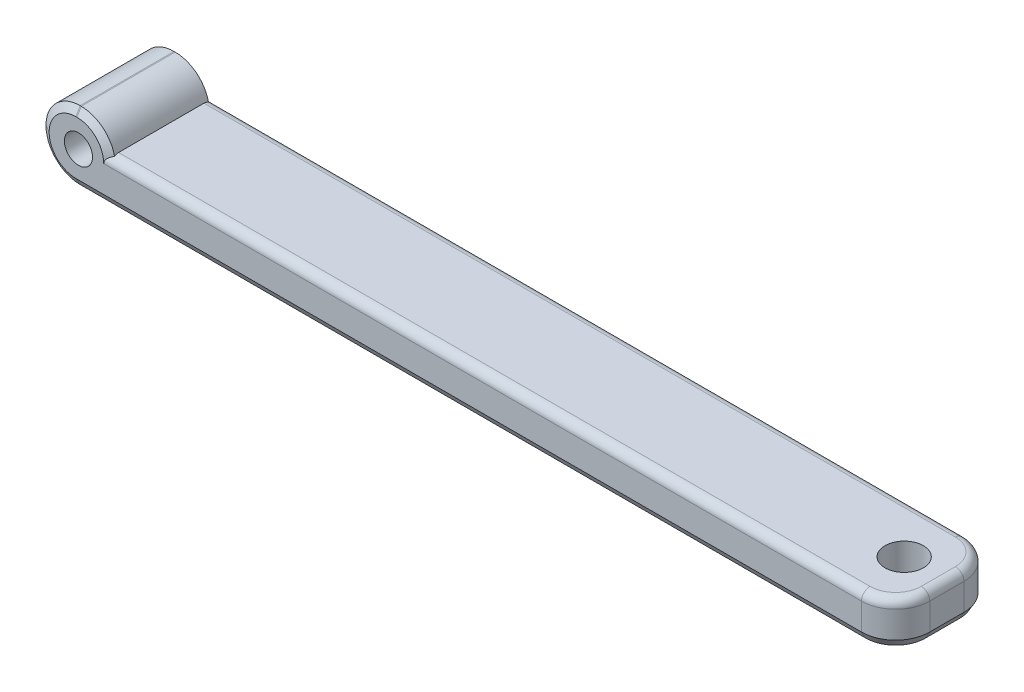
ISO-10303-21;
HEADER;
FILE_DESCRIPTION(('STEP AP214'),'2;1');
FILE_NAME('part.step','',(''),(''),'','','');
FILE_SCHEMA(('AUTOMOTIVE_DESIGN { 1 0 10303 214 1 1 1 1 }'));
ENDSEC;
DATA;
#1=APPLICATION_CONTEXT('core data for automotive mechanical design processes');
#2=APPLICATION_PROTOCOL_DEFINITION('international standard','automotive_design',2000,#1);
#3=PRODUCT_CONTEXT('',#1,'mechanical');
#4=PRODUCT('Part','Part','',(#3));
#5=PRODUCT_RELATED_PRODUCT_CATEGORY('part','',(#4));
#6=PRODUCT_DEFINITION_FORMATION('','',#4);
#7=PRODUCT_DEFINITION_CONTEXT('part definition',#1,'design');
#8=PRODUCT_DEFINITION('design','',#6,#7);
#9=PRODUCT_DEFINITION_SHAPE('','',#8);
#10=(LENGTH_UNIT() NAMED_UNIT(*) SI_UNIT(.MILLI.,.METRE.));
#11=(NAMED_UNIT(*) PLANE_ANGLE_UNIT() SI_UNIT($,.RADIAN.));
#12=(NAMED_UNIT(*) SI_UNIT($,.STERADIAN.) SOLID_ANGLE_UNIT());
#13=UNCERTAINTY_MEASURE_WITH_UNIT(LENGTH_MEASURE(1.E-05),#10,'distance_accuracy_value','');
#14=(GEOMETRIC_REPRESENTATION_CONTEXT(3) GLOBAL_UNCERTAINTY_ASSIGNED_CONTEXT((#13)) GLOBAL_UNIT_ASSIGNED_CONTEXT((#10,
#11,#12)) REPRESENTATION_CONTEXT('',''));
#15=CARTESIAN_POINT('',(0.,0.,0.));
#16=DIRECTION('',(0.,0.,1.));
#17=DIRECTION('',(1.,0.,0.));
#18=AXIS2_PLACEMENT_3D('',#15,#16,#17);
#19=CARTESIAN_POINT('',(0.,5.,0.));
#20=DIRECTION('',(0.,-1.,0.));
#21=DIRECTION('',(0.,0.,-1.));
#22=AXIS2_PLACEMENT_3D('',#19,#20,#21);
#23=PLANE('',#22);
#24=CARTESIAN_POINT('',(45.,5.,0.));
#25=DIRECTION('',(0.,1.,0.));
#26=DIRECTION('',(0.,0.,1.));
#27=AXIS2_PLACEMENT_3D('',#24,#25,#26);
#28=CIRCLE('',#27,2.25);
#29=CARTESIAN_POINT('',(45.,5.,2.25));
#30=VERTEX_POINT('',#29);
#31=EDGE_CURVE('E334',#30,#30,#28,.T.);
#32=ORIENTED_EDGE('',*,*,#31,.F.);
#33=EDGE_LOOP('',(#32));
#34=FACE_BOUND('',#33,.T.);
#35=CARTESIAN_POINT('',(46.,5.,-2.));
#36=DIRECTION('',(0.,-1.,0.));
#37=DIRECTION('',(0.,0.,-1.));
#38=AXIS2_PLACEMENT_3D('',#35,#36,#37);
#39=CIRCLE('',#38,3.);
#40=CARTESIAN_POINT('',(49.,5.,-2.));
#41=VERTEX_POINT('',#40);
#42=CARTESIAN_POINT('',(46.,5.,-5.));
#43=VERTEX_POINT('',#42);
#44=EDGE_CURVE('E343',#41,#43,#39,.F.);
#45=ORIENTED_EDGE('',*,*,#44,.T.);
#46=DIRECTION('',(-1.,0.,0.));
#47=VECTOR('',#46,1.);
#48=CARTESIAN_POINT('',(0.,5.,-5.));
#49=LINE('',#48,#47);
#50=CARTESIAN_POINT('',(-42.,5.,-5.));
#51=VERTEX_POINT('',#50);
#52=EDGE_CURVE('E346',#43,#51,#49,.T.);
#53=ORIENTED_EDGE('',*,*,#52,.T.);
#54=DIRECTION('',(0.,0.,-1.));
#55=VECTOR('',#54,1.);
#56=CARTESIAN_POINT('',(-42.,5.,-6.));
#57=LINE('',#56,#55);
#58=CARTESIAN_POINT('',(-42.,5.,5.));
#59=VERTEX_POINT('',#58);
#60=EDGE_CURVE('E475',#59,#51,#57,.T.);
#61=ORIENTED_EDGE('',*,*,#60,.F.);
#62=DIRECTION('',(1.,0.,0.));
#63=VECTOR('',#62,1.);
#64=CARTESIAN_POINT('',(0.,5.,5.));
#65=LINE('',#64,#63);
#66=CARTESIAN_POINT('',(46.,5.,5.));
#67=VERTEX_POINT('',#66);
#68=EDGE_CURVE('E294',#59,#67,#65,.T.);
#69=ORIENTED_EDGE('',*,*,#68,.T.);
#70=CARTESIAN_POINT('',(46.,5.,2.));
#71=DIRECTION('',(0.,-1.,0.));
#72=DIRECTION('',(0.,0.,-1.));
#73=AXIS2_PLACEMENT_3D('',#70,#71,#72);
#74=CIRCLE('',#73,3.);
#75=CARTESIAN_POINT('',(49.,5.,2.));
#76=VERTEX_POINT('',#75);
#77=EDGE_CURVE('E337',#67,#76,#74,.F.);
#78=ORIENTED_EDGE('',*,*,#77,.T.);
#79=DIRECTION('',(0.,0.,-1.));
#80=VECTOR('',#79,1.);
#81=CARTESIAN_POINT('',(49.,5.,0.));
#82=LINE('',#81,#80);
#83=EDGE_CURVE('E340',#76,#41,#82,.T.);
#84=ORIENTED_EDGE('',*,*,#83,.T.);
#85=EDGE_LOOP('',(#45,#53,#61,#69,#78,#84));
#86=FACE_BOUND('',#85,.T.);
#87=ADVANCED_FACE('F41',(#34,#86),#23,.F.);
#88=CARTESIAN_POINT('',(50.,5.,6.));
#89=DIRECTION('',(-1.,0.,0.));
#90=DIRECTION('',(0.,0.,1.));
#91=AXIS2_PLACEMENT_3D('',#88,#89,#90);
#92=PLANE('',#91);
#93=DIRECTION('',(0.,-1.,0.));
#94=VECTOR('',#93,1.);
#95=CARTESIAN_POINT('',(50.,5.,-2.));
#96=LINE('',#95,#94);
#97=CARTESIAN_POINT('',(50.,0.866025403784468,-2.));
#98=VERTEX_POINT('',#97);
#99=CARTESIAN_POINT('',(50.,4.,-2.));
#100=VERTEX_POINT('',#99);
#101=EDGE_CURVE('E196',#98,#100,#96,.F.);
#102=ORIENTED_EDGE('',*,*,#101,.T.);
#103=DIRECTION('',(0.,0.,-1.));
#104=VECTOR('',#103,1.);
#105=CARTESIAN_POINT('',(50.,4.,6.));
#106=LINE('',#105,#104);
#107=CARTESIAN_POINT('',(50.,4.,2.));
#108=VERTEX_POINT('',#107);
#109=EDGE_CURVE('E355',#100,#108,#106,.F.);
#110=ORIENTED_EDGE('',*,*,#109,.T.);
#111=DIRECTION('',(0.,-1.,0.));
#112=VECTOR('',#111,1.);
#113=CARTESIAN_POINT('',(50.,5.,2.));
#114=LINE('',#113,#112);
#115=CARTESIAN_POINT('',(50.,0.866025403784468,2.));
#116=VERTEX_POINT('',#115);
#117=EDGE_CURVE('E187',#108,#116,#114,.T.);
#118=ORIENTED_EDGE('',*,*,#117,.T.);
#119=DIRECTION('',(0.,0.,-1.));
#120=VECTOR('',#119,1.);
#121=CARTESIAN_POINT('',(50.,0.866025403784468,-2.));
#122=LINE('',#121,#120);
#123=EDGE_CURVE('E201',#116,#98,#122,.T.);
#124=ORIENTED_EDGE('',*,*,#123,.T.);
#125=EDGE_LOOP('',(#102,#110,#118,#124));
#126=FACE_BOUND('',#125,.T.);
#127=ADVANCED_FACE('F392',(#126),#92,.F.);
#128=CARTESIAN_POINT('',(-50.,5.,-6.));
#129=DIRECTION('',(0.,0.,1.));
#130=DIRECTION('',(1.,0.,0.));
#131=AXIS2_PLACEMENT_3D('',#128,#129,#130);
#132=PLANE('',#131);
#133=CARTESIAN_POINT('',(-45.7,4.,-6.));
#134=DIRECTION('',(0.,0.,1.));
#135=DIRECTION('',(1.,0.,0.));
#136=AXIS2_PLACEMENT_3D('',#133,#134,#135);
#137=CIRCLE('',#136,1.65);
#138=CARTESIAN_POINT('',(-44.05,4.,-6.));
#139=VERTEX_POINT('',#138);
#140=EDGE_CURVE('E479',#139,#139,#137,.T.);
#141=ORIENTED_EDGE('',*,*,#140,.T.);
#142=EDGE_LOOP('',(#141));
#143=FACE_BOUND('',#142,.T.);
#144=CARTESIAN_POINT('',(-45.8729833462074,4.,-6.));
#145=DIRECTION('',(0.,0.,1.));
#146=DIRECTION('',(1.,0.,0.));
#147=AXIS2_PLACEMENT_3D('',#144,#145,#146);
#148=CIRCLE('',#147,3.13397459621553);
#149=CARTESIAN_POINT('',(-45.8729833462074,7.13397459621553,-6.));
#150=VERTEX_POINT('',#149);
#151=CARTESIAN_POINT('',(-42.7390087499919,4.,-6.));
#152=VERTEX_POINT('',#151);
#153=EDGE_CURVE('E235',#150,#152,#148,.F.);
#154=ORIENTED_EDGE('',*,*,#153,.T.);
#155=DIRECTION('',(-1.,0.,0.));
#156=VECTOR('',#155,1.);
#157=CARTESIAN_POINT('',(-50.,4.,-6.));
#158=LINE('',#157,#156);
#159=CARTESIAN_POINT('',(46.,4.,-6.));
#160=VERTEX_POINT('',#159);
#161=EDGE_CURVE('E183',#152,#160,#158,.F.);
#162=ORIENTED_EDGE('',*,*,#161,.T.);
#163=DIRECTION('',(0.,-1.,0.));
#164=VECTOR('',#163,1.);
#165=CARTESIAN_POINT('',(46.,5.,-6.));
#166=LINE('',#165,#164);
#167=CARTESIAN_POINT('',(46.,0.866025403784468,-6.));
#168=VERTEX_POINT('',#167);
#169=EDGE_CURVE('E176',#160,#168,#166,.T.);
#170=ORIENTED_EDGE('',*,*,#169,.T.);
#171=DIRECTION('',(-1.,0.,0.));
#172=VECTOR('',#171,1.);
#173=CARTESIAN_POINT('',(-46.,0.866025403784468,-6.));
#174=LINE('',#173,#172);
#175=CARTESIAN_POINT('',(-46.,0.866025403784468,-6.));
#176=VERTEX_POINT('',#175);
#177=EDGE_CURVE('E180',#168,#176,#174,.T.);
#178=ORIENTED_EDGE('',*,*,#177,.T.);
#179=CARTESIAN_POINT('',(-46.,4.,-6.));
#180=DIRECTION('',(0.,0.,1.));
#181=DIRECTION('',(1.,0.,0.));
#182=AXIS2_PLACEMENT_3D('',#179,#180,#181);
#183=CIRCLE('',#182,3.13397459621553);
#184=CARTESIAN_POINT('',(-49.1339745962155,4.,-6.));
#185=VERTEX_POINT('',#184);
#186=EDGE_CURVE('E219',#176,#185,#183,.F.);
#187=ORIENTED_EDGE('',*,*,#186,.T.);
#188=CARTESIAN_POINT('',(-46.,4.,-6.));
#189=DIRECTION('',(0.,0.,1.));
#190=DIRECTION('',(1.,0.,0.));
#191=AXIS2_PLACEMENT_3D('',#188,#189,#190);
#192=CIRCLE('',#191,3.13397459621553);
#193=CARTESIAN_POINT('',(-46.,7.13397459621553,-6.));
#194=VERTEX_POINT('',#193);
#195=EDGE_CURVE('E224',#185,#194,#192,.F.);
#196=ORIENTED_EDGE('',*,*,#195,.T.);
#197=DIRECTION('',(1.,0.,0.));
#198=VECTOR('',#197,1.);
#199=CARTESIAN_POINT('',(-45.8729833462074,7.13397459621553,-6.));
#200=LINE('',#199,#198);
#201=EDGE_CURVE('E232',#194,#150,#200,.T.);
#202=ORIENTED_EDGE('',*,*,#201,.T.);
#203=EDGE_LOOP('',(#154,#162,#170,#178,#187,#196,#202));
#204=FACE_BOUND('',#203,.T.);
#205=ADVANCED_FACE('F178',(#143,#204),#132,.F.);
#206=CARTESIAN_POINT('',(-50.,5.,6.));
#207=DIRECTION('',(0.,0.,-1.));
#208=DIRECTION('',(-1.,0.,0.));
#209=AXIS2_PLACEMENT_3D('',#206,#207,#208);
#210=PLANE('',#209);
#211=CARTESIAN_POINT('',(-45.7,4.,6.));
#212=DIRECTION('',(0.,0.,1.));
#213=DIRECTION('',(1.,0.,0.));
#214=AXIS2_PLACEMENT_3D('',#211,#212,#213);
#215=CIRCLE('',#214,1.65);
#216=CARTESIAN_POINT('',(-44.05,4.,6.));
#217=VERTEX_POINT('',#216);
#218=EDGE_CURVE('E462',#217,#217,#215,.T.);
#219=ORIENTED_EDGE('',*,*,#218,.F.);
#220=EDGE_LOOP('',(#219));
#221=FACE_BOUND('',#220,.T.);
#222=DIRECTION('',(0.,-1.,0.));
#223=VECTOR('',#222,1.);
#224=CARTESIAN_POINT('',(46.,5.,6.));
#225=LINE('',#224,#223);
#226=CARTESIAN_POINT('',(46.,0.866025403784468,6.));
#227=VERTEX_POINT('',#226);
#228=CARTESIAN_POINT('',(46.,4.,6.));
#229=VERTEX_POINT('',#228);
#230=EDGE_CURVE('E220',#227,#229,#225,.F.);
#231=ORIENTED_EDGE('',*,*,#230,.T.);
#232=DIRECTION('',(1.,0.,0.));
#233=VECTOR('',#232,1.);
#234=CARTESIAN_POINT('',(-50.,4.,6.));
#235=LINE('',#234,#233);
#236=CARTESIAN_POINT('',(-42.7390087499919,4.,6.));
#237=VERTEX_POINT('',#236);
#238=EDGE_CURVE('E361',#229,#237,#235,.F.);
#239=ORIENTED_EDGE('',*,*,#238,.T.);
#240=CARTESIAN_POINT('',(-45.8729833462074,4.,6.));
#241=DIRECTION('',(0.,0.,-1.));
#242=DIRECTION('',(-1.,0.,0.));
#243=AXIS2_PLACEMENT_3D('',#240,#241,#242);
#244=CIRCLE('',#243,3.13397459621553);
#245=CARTESIAN_POINT('',(-45.8729833462074,7.13397459621553,6.));
#246=VERTEX_POINT('',#245);
#247=EDGE_CURVE('E279',#237,#246,#244,.F.);
#248=ORIENTED_EDGE('',*,*,#247,.T.);
#249=DIRECTION('',(-1.,0.,0.));
#250=VECTOR('',#249,1.);
#251=CARTESIAN_POINT('',(-46.,7.13397459621553,6.));
#252=LINE('',#251,#250);
#253=CARTESIAN_POINT('',(-46.,7.13397459621553,6.));
#254=VERTEX_POINT('',#253);
#255=EDGE_CURVE('E282',#246,#254,#252,.T.);
#256=ORIENTED_EDGE('',*,*,#255,.T.);
#257=CARTESIAN_POINT('',(-46.,4.,6.));
#258=DIRECTION('',(0.,0.,-1.));
#259=DIRECTION('',(-1.,0.,0.));
#260=AXIS2_PLACEMENT_3D('',#257,#258,#259);
#261=CIRCLE('',#260,3.13397459621553);
#262=CARTESIAN_POINT('',(-49.1339745962155,4.,6.));
#263=VERTEX_POINT('',#262);
#264=EDGE_CURVE('E285',#254,#263,#261,.F.);
#265=ORIENTED_EDGE('',*,*,#264,.T.);
#266=CARTESIAN_POINT('',(-46.,4.,6.));
#267=DIRECTION('',(0.,0.,-1.));
#268=DIRECTION('',(-1.,0.,0.));
#269=AXIS2_PLACEMENT_3D('',#266,#267,#268);
#270=CIRCLE('',#269,3.13397459621553);
#271=CARTESIAN_POINT('',(-46.,0.866025403784468,6.));
#272=VERTEX_POINT('',#271);
#273=EDGE_CURVE('E288',#263,#272,#270,.F.);
#274=ORIENTED_EDGE('',*,*,#273,.T.);
#275=DIRECTION('',(1.,0.,0.));
#276=VECTOR('',#275,1.);
#277=CARTESIAN_POINT('',(46.,0.866025403784468,6.));
#278=LINE('',#277,#276);
#279=EDGE_CURVE('E291',#272,#227,#278,.T.);
#280=ORIENTED_EDGE('',*,*,#279,.T.);
#281=EDGE_LOOP('',(#231,#239,#248,#256,#265,#274,#280));
#282=FACE_BOUND('',#281,.T.);
#283=ADVANCED_FACE('F433',(#221,#282),#210,.F.);
#284=CARTESIAN_POINT('',(0.,0.,0.));
#285=DIRECTION('',(0.,-1.,0.));
#286=DIRECTION('',(0.,0.,-1.));
#287=AXIS2_PLACEMENT_3D('',#284,#285,#286);
#288=PLANE('',#287);
#289=CARTESIAN_POINT('',(45.,0.,0.));
#290=DIRECTION('',(0.,1.,0.));
#291=DIRECTION('',(0.,0.,1.));
#292=AXIS2_PLACEMENT_3D('',#289,#290,#291);
#293=CIRCLE('',#292,2.25);
#294=CARTESIAN_POINT('',(45.,0.,2.25));
#295=VERTEX_POINT('',#294);
#296=EDGE_CURVE('E463',#295,#295,#293,.T.);
#297=ORIENTED_EDGE('',*,*,#296,.T.);
#298=EDGE_LOOP('',(#297));
#299=FACE_BOUND('',#298,.T.);
#300=DIRECTION('',(0.,0.,1.));
#301=VECTOR('',#300,1.);
#302=CARTESIAN_POINT('',(-46.,0.,-6.));
#303=LINE('',#302,#301);
#304=CARTESIAN_POINT('',(-46.,0.,5.49999999999999));
#305=VERTEX_POINT('',#304);
#306=CARTESIAN_POINT('',(-46.,0.,-5.49999999999999));
#307=VERTEX_POINT('',#306);
#308=EDGE_CURVE('E188',#305,#307,#303,.F.);
#309=ORIENTED_EDGE('',*,*,#308,.T.);
#310=DIRECTION('',(1.,0.,0.));
#311=VECTOR('',#310,1.);
#312=CARTESIAN_POINT('',(46.,0.,-5.49999999999999));
#313=LINE('',#312,#311);
#314=CARTESIAN_POINT('',(46.,0.,-5.49999999999998));
#315=VERTEX_POINT('',#314);
#316=EDGE_CURVE('E202',#307,#315,#313,.T.);
#317=ORIENTED_EDGE('',*,*,#316,.T.);
#318=CARTESIAN_POINT('',(46.,0.,-2.));
#319=DIRECTION('',(0.,-1.,0.));
#320=DIRECTION('',(0.,0.,-1.));
#321=AXIS2_PLACEMENT_3D('',#318,#319,#320);
#322=CIRCLE('',#321,3.49999999999998);
#323=CARTESIAN_POINT('',(49.5,0.,-2.));
#324=VERTEX_POINT('',#323);
#325=EDGE_CURVE('E208',#315,#324,#322,.T.);
#326=ORIENTED_EDGE('',*,*,#325,.T.);
#327=DIRECTION('',(0.,0.,1.));
#328=VECTOR('',#327,1.);
#329=CARTESIAN_POINT('',(49.5,0.,2.));
#330=LINE('',#329,#328);
#331=CARTESIAN_POINT('',(49.5,0.,2.));
#332=VERTEX_POINT('',#331);
#333=EDGE_CURVE('E266',#324,#332,#330,.T.);
#334=ORIENTED_EDGE('',*,*,#333,.T.);
#335=CARTESIAN_POINT('',(46.,0.,2.));
#336=DIRECTION('',(0.,-1.,0.));
#337=DIRECTION('',(0.,0.,-1.));
#338=AXIS2_PLACEMENT_3D('',#335,#336,#337);
#339=CIRCLE('',#338,3.49999999999999);
#340=CARTESIAN_POINT('',(46.,0.,5.49999999999999));
#341=VERTEX_POINT('',#340);
#342=EDGE_CURVE('E263',#332,#341,#339,.T.);
#343=ORIENTED_EDGE('',*,*,#342,.T.);
#344=DIRECTION('',(-1.,0.,0.));
#345=VECTOR('',#344,1.);
#346=CARTESIAN_POINT('',(-46.,0.,5.49999999999999));
#347=LINE('',#346,#345);
#348=EDGE_CURVE('E260',#341,#305,#347,.T.);
#349=ORIENTED_EDGE('',*,*,#348,.T.);
#350=EDGE_LOOP('',(#309,#317,#326,#334,#343,#349));
#351=FACE_BOUND('',#350,.T.);
#352=ADVANCED_FACE('F493',(#299,#351),#288,.T.);
#353=CARTESIAN_POINT('',(0.,8.,0.));
#354=DIRECTION('',(0.,1.,0.));
#355=DIRECTION('',(0.,0.,1.));
#356=AXIS2_PLACEMENT_3D('',#353,#354,#355);
#357=PLANE('',#356);
#358=DIRECTION('',(0.,0.,-1.));
#359=VECTOR('',#358,1.);
#360=CARTESIAN_POINT('',(-45.8729833462074,8.,-6.));
#361=LINE('',#360,#359);
#362=CARTESIAN_POINT('',(-45.8729833462074,8.,5.49999999999999));
#363=VERTEX_POINT('',#362);
#364=CARTESIAN_POINT('',(-45.8729833462074,8.,-5.49999999999999));
#365=VERTEX_POINT('',#364);
#366=EDGE_CURVE('E467',#363,#365,#361,.T.);
#367=ORIENTED_EDGE('',*,*,#366,.T.);
#368=DIRECTION('',(-1.,0.,0.));
#369=VECTOR('',#368,1.);
#370=CARTESIAN_POINT('',(-46.,8.,-5.49999999999999));
#371=LINE('',#370,#369);
#372=CARTESIAN_POINT('',(-46.,8.,-5.49999999999999));
#373=VERTEX_POINT('',#372);
#374=EDGE_CURVE('E245',#365,#373,#371,.T.);
#375=ORIENTED_EDGE('',*,*,#374,.T.);
#376=DIRECTION('',(0.,0.,1.));
#377=VECTOR('',#376,1.);
#378=CARTESIAN_POINT('',(-46.,8.,6.));
#379=LINE('',#378,#377);
#380=CARTESIAN_POINT('',(-46.,8.,5.49999999999999));
#381=VERTEX_POINT('',#380);
#382=EDGE_CURVE('E471',#373,#381,#379,.T.);
#383=ORIENTED_EDGE('',*,*,#382,.T.);
#384=DIRECTION('',(1.,0.,0.));
#385=VECTOR('',#384,1.);
#386=CARTESIAN_POINT('',(-45.8729833462074,8.,5.49999999999999));
#387=LINE('',#386,#385);
#388=EDGE_CURVE('E242',#381,#363,#387,.T.);
#389=ORIENTED_EDGE('',*,*,#388,.T.);
#390=EDGE_LOOP('',(#367,#375,#383,#389));
#391=FACE_BOUND('',#390,.T.);
#392=ADVANCED_FACE('F637',(#391),#357,.T.);
#393=CARTESIAN_POINT('',(-45.7,4.,-6.));
#394=DIRECTION('',(0.,0.,1.));
#395=DIRECTION('',(1.,0.,0.));
#396=AXIS2_PLACEMENT_3D('',#393,#394,#395);
#397=CYLINDRICAL_SURFACE('',#396,1.65);
#398=ORIENTED_EDGE('',*,*,#140,.F.);
#399=EDGE_LOOP('',(#398));
#400=FACE_BOUND('',#399,.T.);
#401=ORIENTED_EDGE('',*,*,#218,.T.);
#402=EDGE_LOOP('',(#401));
#403=FACE_BOUND('',#402,.T.);
#404=ADVANCED_FACE('F391',(#400,#403),#397,.F.);
#405=CARTESIAN_POINT('',(-45.8729833462074,4.,-6.));
#406=DIRECTION('',(0.,0.,1.));
#407=DIRECTION('',(1.,0.,0.));
#408=AXIS2_PLACEMENT_3D('',#405,#406,#407);
#409=CYLINDRICAL_SURFACE('',#408,4.);
#410=CARTESIAN_POINT('',(-45.8729833462074,4.,5.49999999999999));
#411=DIRECTION('',(0.,0.,-1.));
#412=DIRECTION('',(-1.,0.,0.));
#413=AXIS2_PLACEMENT_3D('',#410,#411,#412);
#414=CIRCLE('',#413,4.);
#415=CARTESIAN_POINT('',(-41.9678585082541,4.86602540378445,5.49999999999999));
#416=VERTEX_POINT('',#415);
#417=EDGE_CURVE('E59',#363,#416,#414,.T.);
#418=ORIENTED_EDGE('',*,*,#417,.T.);
#419=CARTESIAN_POINT('',(-41.9678585082541,4.86602540378445,5.49999999999999));
#420=CARTESIAN_POINT('',(-41.9709383087646,4.87990979292056,5.47594863028791));
#421=CARTESIAN_POINT('',(-41.9738724613319,4.89279419535412,5.45131917317802));
#422=CARTESIAN_POINT('',(-41.9793733406712,4.91648774158659,5.40102985996441));
#423=CARTESIAN_POINT('',(-41.9819399149463,4.92729602469873,5.37536958182549));
#424=CARTESIAN_POINT('',(-41.9888617307128,4.95602702036273,5.29827118445288));
#425=CARTESIAN_POINT('',(-41.9925884887029,4.97090448888967,5.24558731544247));
#426=CARTESIAN_POINT('',(-41.9967967632164,4.98753028239606,5.16065936986987));
#427=CARTESIAN_POINT('',(-41.9979830126866,4.99216390273026,5.12897644215731));
#428=CARTESIAN_POINT('',(-41.999591775596,4.99841961221937,5.06487255344517));
#429=CARTESIAN_POINT('',(-42.0000039906974,5.00000110108258,5.0324473721233));
#430=CARTESIAN_POINT('',(-42.,5.,5.));
#431=B_SPLINE_CURVE_WITH_KNOTS('',3,(#419,#420,#421,#422,#423,#424,#425,#426,#427,#428,#429,
#430),.UNSPECIFIED.,.F.,.F.,(4,2,2,2,2,4),(0.,0.0837687980476082,0.167572249124045,
0.33129700111531,0.427286217209491,0.524543738116927),.UNSPECIFIED.);
#432=EDGE_CURVE('E11',#416,#59,#431,.T.);
#433=ORIENTED_EDGE('',*,*,#432,.T.);
#434=ORIENTED_EDGE('',*,*,#60,.T.);
#435=CARTESIAN_POINT('',(-42.,5.,-5.));
#436=CARTESIAN_POINT('',(-42.0000017379415,4.99999949121856,-5.02794000066796));
#437=CARTESIAN_POINT('',(-41.9996972122002,4.99882801683094,-5.05586278315993));
#438=CARTESIAN_POINT('',(-41.9984948600862,4.99415679005778,-5.1115037602623));
#439=CARTESIAN_POINT('',(-41.9975969564242,4.99065673436679,-5.13922192774529));
#440=CARTESIAN_POINT('',(-41.9940964320881,4.9768979997052,-5.2205422206099));
#441=CARTESIAN_POINT('',(-41.9906847095091,4.9633770357187,-5.27360578977258));
#442=CARTESIAN_POINT('',(-41.9838549771225,4.9353025708408,-5.35529423924067));
#443=CARTESIAN_POINT('',(-41.9810226933179,4.92348692816167,-5.38495308622499));
#444=CARTESIAN_POINT('',(-41.9748168333834,4.89693025307165,-5.44334723419045));
#445=CARTESIAN_POINT('',(-41.9714366422686,4.88215286915174,-5.47206531015885));
#446=CARTESIAN_POINT('',(-41.9678585082541,4.86602540378445,-5.49999999999998));
#447=B_SPLINE_CURVE_WITH_KNOTS('',3,(#435,#436,#437,#438,#439,#440,#441,#442,#443,#444,#445,
#446),.UNSPECIFIED.,.F.,.F.,(4,2,2,2,2,4),(0.,0.0837598109488193,0.167530534028091,
0.331234359316737,0.427259260936388,0.524544166201067),.UNSPECIFIED.);
#448=CARTESIAN_POINT('',(-41.9678585082541,4.86602540378445,-5.49999999999999));
#449=VERTEX_POINT('',#448);
#450=EDGE_CURVE('E365',#51,#449,#447,.T.);
#451=ORIENTED_EDGE('',*,*,#450,.T.);
#452=CARTESIAN_POINT('',(-45.8729833462074,4.,-5.49999999999999));
#453=DIRECTION('',(0.,0.,1.));
#454=DIRECTION('',(1.,0.,0.));
#455=AXIS2_PLACEMENT_3D('',#452,#453,#454);
#456=CIRCLE('',#455,4.);
#457=EDGE_CURVE('E67',#449,#365,#456,.T.);
#458=ORIENTED_EDGE('',*,*,#457,.T.);
#459=ORIENTED_EDGE('',*,*,#366,.F.);
#460=EDGE_LOOP('',(#418,#433,#434,#451,#458,#459));
#461=FACE_BOUND('',#460,.T.);
#462=ADVANCED_FACE('F385',(#461),#409,.T.);
#463=CARTESIAN_POINT('',(-46.,4.,0.));
#464=DIRECTION('',(0.,0.,-1.));
#465=DIRECTION('',(-1.,0.,0.));
#466=AXIS2_PLACEMENT_3D('',#463,#464,#465);
#467=CYLINDRICAL_SURFACE('',#466,4.);
#468=ORIENTED_EDGE('',*,*,#382,.F.);
#469=CARTESIAN_POINT('',(-46.,4.,-5.49999999999999));
#470=DIRECTION('',(0.,0.,1.));
#471=DIRECTION('',(1.,0.,0.));
#472=AXIS2_PLACEMENT_3D('',#469,#470,#471);
#473=CIRCLE('',#472,4.);
#474=CARTESIAN_POINT('',(-50.,4.,-5.49999999999999));
#475=VERTEX_POINT('',#474);
#476=EDGE_CURVE('E251',#373,#475,#473,.T.);
#477=ORIENTED_EDGE('',*,*,#476,.T.);
#478=DIRECTION('',(0.,0.,1.));
#479=VECTOR('',#478,1.);
#480=CARTESIAN_POINT('',(-50.,4.,-6.));
#481=LINE('',#480,#479);
#482=CARTESIAN_POINT('',(-50.,4.,5.49999999999999));
#483=VERTEX_POINT('',#482);
#484=EDGE_CURVE('E458',#483,#475,#481,.F.);
#485=ORIENTED_EDGE('',*,*,#484,.F.);
#486=CARTESIAN_POINT('',(-46.,4.,5.49999999999999));
#487=DIRECTION('',(0.,0.,-1.));
#488=DIRECTION('',(-1.,0.,0.));
#489=AXIS2_PLACEMENT_3D('',#486,#487,#488);
#490=CIRCLE('',#489,4.);
#491=EDGE_CURVE('E248',#483,#381,#490,.T.);
#492=ORIENTED_EDGE('',*,*,#491,.T.);
#493=EDGE_LOOP('',(#468,#477,#485,#492));
#494=FACE_BOUND('',#493,.T.);
#495=ADVANCED_FACE('F390',(#494),#467,.T.);
#496=CARTESIAN_POINT('',(-46.,4.,6.));
#497=DIRECTION('',(0.,0.,-1.));
#498=DIRECTION('',(-1.,0.,0.));
#499=AXIS2_PLACEMENT_3D('',#496,#497,#498);
#500=CYLINDRICAL_SURFACE('',#499,4.);
#501=ORIENTED_EDGE('',*,*,#484,.T.);
#502=CARTESIAN_POINT('',(-46.,4.,-5.49999999999999));
#503=DIRECTION('',(0.,0.,1.));
#504=DIRECTION('',(1.,0.,0.));
#505=AXIS2_PLACEMENT_3D('',#502,#503,#504);
#506=CIRCLE('',#505,4.);
#507=EDGE_CURVE('E257',#475,#307,#506,.T.);
#508=ORIENTED_EDGE('',*,*,#507,.T.);
#509=ORIENTED_EDGE('',*,*,#308,.F.);
#510=CARTESIAN_POINT('',(-46.,4.,5.49999999999999));
#511=DIRECTION('',(0.,0.,-1.));
#512=DIRECTION('',(-1.,0.,0.));
#513=AXIS2_PLACEMENT_3D('',#510,#511,#512);
#514=CIRCLE('',#513,4.);
#515=EDGE_CURVE('E254',#305,#483,#514,.T.);
#516=ORIENTED_EDGE('',*,*,#515,.T.);
#517=EDGE_LOOP('',(#501,#508,#509,#516));
#518=FACE_BOUND('',#517,.T.);
#519=ADVANCED_FACE('F394',(#518),#500,.T.);
#520=CARTESIAN_POINT('',(45.,0.,0.));
#521=DIRECTION('',(0.,1.,0.));
#522=DIRECTION('',(0.,0.,1.));
#523=AXIS2_PLACEMENT_3D('',#520,#521,#522);
#524=CYLINDRICAL_SURFACE('',#523,2.25);
#525=ORIENTED_EDGE('',*,*,#296,.F.);
#526=EDGE_LOOP('',(#525));
#527=FACE_BOUND('',#526,.T.);
#528=ORIENTED_EDGE('',*,*,#31,.T.);
#529=EDGE_LOOP('',(#528));
#530=FACE_BOUND('',#529,.T.);
#531=ADVANCED_FACE('F496',(#527,#530),#524,.F.);
#532=CARTESIAN_POINT('',(46.,5.,-2.));
#533=DIRECTION('',(0.,-1.,0.));
#534=DIRECTION('',(0.,0.,-1.));
#535=AXIS2_PLACEMENT_3D('',#532,#533,#534);
#536=CYLINDRICAL_SURFACE('',#535,4.);
#537=ORIENTED_EDGE('',*,*,#169,.F.);
#538=CARTESIAN_POINT('',(46.,4.,-2.));
#539=DIRECTION('',(0.,-1.,0.));
#540=DIRECTION('',(0.,0.,-1.));
#541=AXIS2_PLACEMENT_3D('',#538,#539,#540);
#542=CIRCLE('',#541,4.);
#543=EDGE_CURVE('E352',#160,#100,#542,.T.);
#544=ORIENTED_EDGE('',*,*,#543,.T.);
#545=ORIENTED_EDGE('',*,*,#101,.F.);
#546=CARTESIAN_POINT('',(46.,0.866025403784468,-2.));
#547=DIRECTION('',(0.,-1.,0.));
#548=DIRECTION('',(0.,0.,-1.));
#549=AXIS2_PLACEMENT_3D('',#546,#547,#548);
#550=CIRCLE('',#549,4.);
#551=EDGE_CURVE('E192',#98,#168,#550,.F.);
#552=ORIENTED_EDGE('',*,*,#551,.T.);
#553=EDGE_LOOP('',(#537,#544,#545,#552));
#554=FACE_BOUND('',#553,.T.);
#555=ADVANCED_FACE('F194',(#554),#536,.T.);
#556=CARTESIAN_POINT('',(46.,5.,2.));
#557=DIRECTION('',(0.,-1.,0.));
#558=DIRECTION('',(0.,0.,-1.));
#559=AXIS2_PLACEMENT_3D('',#556,#557,#558);
#560=CYLINDRICAL_SURFACE('',#559,4.);
#561=ORIENTED_EDGE('',*,*,#117,.F.);
#562=CARTESIAN_POINT('',(46.,4.,2.));
#563=DIRECTION('',(0.,-1.,0.));
#564=DIRECTION('',(0.,0.,-1.));
#565=AXIS2_PLACEMENT_3D('',#562,#563,#564);
#566=CIRCLE('',#565,4.);
#567=EDGE_CURVE('E358',#108,#229,#566,.T.);
#568=ORIENTED_EDGE('',*,*,#567,.T.);
#569=ORIENTED_EDGE('',*,*,#230,.F.);
#570=CARTESIAN_POINT('',(46.,0.866025403784468,2.));
#571=DIRECTION('',(0.,-1.,0.));
#572=DIRECTION('',(0.,0.,-1.));
#573=AXIS2_PLACEMENT_3D('',#570,#571,#572);
#574=CIRCLE('',#573,4.);
#575=EDGE_CURVE('E275',#227,#116,#574,.F.);
#576=ORIENTED_EDGE('',*,*,#575,.T.);
#577=EDGE_LOOP('',(#561,#568,#569,#576));
#578=FACE_BOUND('',#577,.T.);
#579=ADVANCED_FACE('F440',(#578),#560,.T.);
#580=CARTESIAN_POINT('',(-45.8729833462074,4.,6.));
#581=DIRECTION('',(0.,0.,-1.));
#582=DIRECTION('',(-1.,0.,0.));
#583=AXIS2_PLACEMENT_3D('',#580,#581,#582);
#584=CONICAL_SURFACE('',#583,3.13397459621553,1.0471975511966);
#585=ORIENTED_EDGE('',*,*,#247,.F.);
#586=CARTESIAN_POINT('',(-42.7390087499919,4.,6.));
#587=CARTESIAN_POINT('',(-42.7390128845925,4.01981788943689,6.00000373182383));
#588=CARTESIAN_POINT('',(-42.7381755471435,4.03962129208917,5.99941026902393));
#589=CARTESIAN_POINT('',(-42.7348651701486,4.0789994750061,5.997068911207));
#590=CARTESIAN_POINT('',(-42.7323940345345,4.09857449442637,5.99532235993448));
#591=CARTESIAN_POINT('',(-42.7226798929733,4.15623922908415,5.98846877174718));
#592=CARTESIAN_POINT('',(-42.7131334278883,4.1937760232744,5.98174556804885));
#593=CARTESIAN_POINT('',(-42.6887562931093,4.26596425469779,5.96469704362994));
#594=CARTESIAN_POINT('',(-42.6739464327918,4.30062640086918,5.95438591146497));
#595=CARTESIAN_POINT('',(-42.6400216010977,4.36680822857781,5.93096048247879));
#596=CARTESIAN_POINT('',(-42.6208961635701,4.39831999712801,5.91783937490279));
#597=CARTESIAN_POINT('',(-42.5684566556838,4.4735811501807,5.88218508908961));
#598=CARTESIAN_POINT('',(-42.5329429033058,4.51514855764292,5.85831069526222));
#599=CARTESIAN_POINT('',(-42.456599230531,4.59138141034193,5.80769998040868));
#600=CARTESIAN_POINT('',(-42.4157380534543,4.62600297991899,5.78094701128019));
#601=CARTESIAN_POINT('',(-42.3417438575691,4.68079910253185,5.733117717295));
#602=CARTESIAN_POINT('',(-42.3093985388063,4.70238015070677,5.71239517811593));
#603=CARTESIAN_POINT('',(-42.2432371025873,4.7425951650623,5.67037245941148));
#604=CARTESIAN_POINT('',(-42.2094196340187,4.76122634797254,5.64907175630658));
#605=CARTESIAN_POINT('',(-42.1413859711457,4.79549849209724,5.60655877816334));
#606=CARTESIAN_POINT('',(-42.1071917793312,4.81119244242205,5.58535347380016));
#607=CARTESIAN_POINT('',(-42.0380516374776,4.84026579529493,5.54278026093676));
#608=CARTESIAN_POINT('',(-42.0031076183682,4.8536504900256,5.52141284461747));
#609=CARTESIAN_POINT('',(-41.9678585082541,4.86602540378445,5.49999999999999));
#610=B_SPLINE_CURVE_WITH_KNOTS('',3,(#586,#587,#588,#589,#590,#591,#592,#593,#594,#595,#596,
#597,#598,#599,#600,#601,#602,#603,#604,#605,#606,#607,#608,#609),.UNSPECIFIED.,.F.,.F.,(4,2,2,
2,2,2,2,2,2,2,2,4),(0.,0.0594001624704559,0.118731225225522,0.235898742923059,0.352608087761058,
0.469603577994758,0.647577504847176,0.826642523698414,0.958693176523572,1.09086768930277,
1.22036111040165,1.34955370800984),.UNSPECIFIED.);
#611=EDGE_CURVE('E52',#237,#416,#610,.T.);
#612=ORIENTED_EDGE('',*,*,#611,.T.);
#613=ORIENTED_EDGE('',*,*,#417,.F.);
#614=DIRECTION('',(0.,0.86602540378444,-0.499999999999998));
#615=VECTOR('',#614,1.);
#616=CARTESIAN_POINT('',(-45.8729833462074,7.13397459621553,6.));
#617=LINE('',#616,#615);
#618=EDGE_CURVE('E330',#246,#363,#617,.T.);
#619=ORIENTED_EDGE('',*,*,#618,.F.);
#620=EDGE_LOOP('',(#585,#612,#613,#619));
#621=FACE_BOUND('',#620,.T.);
#622=ADVANCED_FACE('F603',(#621),#584,.T.);
#623=CARTESIAN_POINT('',(0.,8.,5.49999999999999));
#624=DIRECTION('',(0.,0.499999999999998,0.86602540378444));
#625=DIRECTION('',(-1.,0.,0.));
#626=AXIS2_PLACEMENT_3D('',#623,#624,#625);
#627=PLANE('',#626);
#628=ORIENTED_EDGE('',*,*,#618,.T.);
#629=ORIENTED_EDGE('',*,*,#388,.F.);
#630=DIRECTION('',(0.,0.86602540378444,-0.499999999999998));
#631=VECTOR('',#630,1.);
#632=CARTESIAN_POINT('',(-46.,7.13397459621553,6.));
#633=LINE('',#632,#631);
#634=EDGE_CURVE('E326',#254,#381,#633,.T.);
#635=ORIENTED_EDGE('',*,*,#634,.F.);
#636=ORIENTED_EDGE('',*,*,#255,.F.);
#637=EDGE_LOOP('',(#628,#629,#635,#636));
#638=FACE_BOUND('',#637,.T.);
#639=ADVANCED_FACE('F597',(#638),#627,.T.);
#640=CARTESIAN_POINT('',(-46.,4.,6.));
#641=DIRECTION('',(0.,0.,-1.));
#642=DIRECTION('',(-1.,0.,0.));
#643=AXIS2_PLACEMENT_3D('',#640,#641,#642);
#644=CONICAL_SURFACE('',#643,3.13397459621553,1.0471975511966);
#645=ORIENTED_EDGE('',*,*,#634,.T.);
#646=ORIENTED_EDGE('',*,*,#491,.F.);
#647=DIRECTION('',(-0.866025403784439,0.,-0.5));
#648=VECTOR('',#647,1.);
#649=CARTESIAN_POINT('',(-49.1339745962155,4.,6.));
#650=LINE('',#649,#648);
#651=EDGE_CURVE('E322',#263,#483,#650,.T.);
#652=ORIENTED_EDGE('',*,*,#651,.F.);
#653=ORIENTED_EDGE('',*,*,#264,.F.);
#654=EDGE_LOOP('',(#645,#646,#652,#653));
#655=FACE_BOUND('',#654,.T.);
#656=ADVANCED_FACE('F590',(#655),#644,.T.);
#657=CARTESIAN_POINT('',(-46.,4.,6.));
#658=DIRECTION('',(0.,0.,-1.));
#659=DIRECTION('',(-1.,0.,0.));
#660=AXIS2_PLACEMENT_3D('',#657,#658,#659);
#661=CONICAL_SURFACE('',#660,3.13397459621553,1.0471975511966);
#662=ORIENTED_EDGE('',*,*,#651,.T.);
#663=ORIENTED_EDGE('',*,*,#515,.F.);
#664=DIRECTION('',(0.,-0.86602540378444,-0.499999999999998));
#665=VECTOR('',#664,1.);
#666=CARTESIAN_POINT('',(-46.,0.866025403784468,6.));
#667=LINE('',#666,#665);
#668=EDGE_CURVE('E318',#272,#305,#667,.T.);
#669=ORIENTED_EDGE('',*,*,#668,.F.);
#670=ORIENTED_EDGE('',*,*,#273,.F.);
#671=EDGE_LOOP('',(#662,#663,#669,#670));
#672=FACE_BOUND('',#671,.T.);
#673=ADVANCED_FACE('F584',(#672),#661,.T.);
#674=CARTESIAN_POINT('',(-50.,0.866025403784468,6.));
#675=DIRECTION('',(0.,-0.499999999999998,0.86602540378444));
#676=DIRECTION('',(-1.,0.,0.));
#677=AXIS2_PLACEMENT_3D('',#674,#675,#676);
#678=PLANE('',#677);
#679=ORIENTED_EDGE('',*,*,#668,.T.);
#680=ORIENTED_EDGE('',*,*,#348,.F.);
#681=DIRECTION('',(0.,-0.86602540378444,-0.499999999999998));
#682=VECTOR('',#681,1.);
#683=CARTESIAN_POINT('',(46.,0.866025403784468,6.));
#684=LINE('',#683,#682);
#685=EDGE_CURVE('E314',#227,#341,#684,.T.);
#686=ORIENTED_EDGE('',*,*,#685,.F.);
#687=ORIENTED_EDGE('',*,*,#279,.F.);
#688=EDGE_LOOP('',(#679,#680,#686,#687));
#689=FACE_BOUND('',#688,.T.);
#690=ADVANCED_FACE('F445',(#689),#678,.T.);
#691=CARTESIAN_POINT('',(46.,0.,2.));
#692=DIRECTION('',(0.,1.,0.));
#693=DIRECTION('',(0.,0.,1.));
#694=AXIS2_PLACEMENT_3D('',#691,#692,#693);
#695=CONICAL_SURFACE('',#694,3.49999999999999,0.523598775598294);
#696=ORIENTED_EDGE('',*,*,#685,.T.);
#697=ORIENTED_EDGE('',*,*,#342,.F.);
#698=DIRECTION('',(-0.499999999999993,-0.866025403784443,0.));
#699=VECTOR('',#698,1.);
#700=CARTESIAN_POINT('',(50.,0.866025403784468,2.));
#701=LINE('',#700,#699);
#702=EDGE_CURVE('E310',#116,#332,#701,.T.);
#703=ORIENTED_EDGE('',*,*,#702,.F.);
#704=ORIENTED_EDGE('',*,*,#575,.F.);
#705=EDGE_LOOP('',(#696,#697,#703,#704));
#706=FACE_BOUND('',#705,.T.);
#707=ADVANCED_FACE('F448',(#706),#695,.T.);
#708=CARTESIAN_POINT('',(50.,0.866025403784468,6.));
#709=DIRECTION('',(0.86602540378444,-0.499999999999998,0.));
#710=DIRECTION('',(0.,0.,1.));
#711=AXIS2_PLACEMENT_3D('',#708,#709,#710);
#712=PLANE('',#711);
#713=ORIENTED_EDGE('',*,*,#702,.T.);
#714=ORIENTED_EDGE('',*,*,#333,.F.);
#715=DIRECTION('',(-0.499999999999998,-0.86602540378444,0.));
#716=VECTOR('',#715,1.);
#717=CARTESIAN_POINT('',(50.,0.866025403784468,-2.));
#718=LINE('',#717,#716);
#719=EDGE_CURVE('E212',#98,#324,#718,.T.);
#720=ORIENTED_EDGE('',*,*,#719,.F.);
#721=ORIENTED_EDGE('',*,*,#123,.F.);
#722=EDGE_LOOP('',(#713,#714,#720,#721));
#723=FACE_BOUND('',#722,.T.);
#724=ADVANCED_FACE('F452',(#723),#712,.T.);
#725=CARTESIAN_POINT('',(46.,0.,-2.));
#726=DIRECTION('',(0.,1.,0.));
#727=DIRECTION('',(0.,0.,1.));
#728=AXIS2_PLACEMENT_3D('',#725,#726,#727);
#729=CONICAL_SURFACE('',#728,3.49999999999999,0.523598775598297);
#730=ORIENTED_EDGE('',*,*,#719,.T.);
#731=ORIENTED_EDGE('',*,*,#325,.F.);
#732=DIRECTION('',(0.,-0.866025403784438,0.500000000000001));
#733=VECTOR('',#732,1.);
#734=CARTESIAN_POINT('',(46.,0.866025403784468,-6.));
#735=LINE('',#734,#733);
#736=EDGE_CURVE('E206',#168,#315,#735,.T.);
#737=ORIENTED_EDGE('',*,*,#736,.F.);
#738=ORIENTED_EDGE('',*,*,#551,.F.);
#739=EDGE_LOOP('',(#730,#731,#737,#738));
#740=FACE_BOUND('',#739,.T.);
#741=ADVANCED_FACE('F207',(#740),#729,.T.);
#742=CARTESIAN_POINT('',(-50.,0.866025403784468,-6.));
#743=DIRECTION('',(0.,-0.499999999999998,-0.86602540378444));
#744=DIRECTION('',(1.,0.,0.));
#745=AXIS2_PLACEMENT_3D('',#742,#743,#744);
#746=PLANE('',#745);
#747=ORIENTED_EDGE('',*,*,#736,.T.);
#748=ORIENTED_EDGE('',*,*,#316,.F.);
#749=DIRECTION('',(0.,-0.86602540378444,0.499999999999998));
#750=VECTOR('',#749,1.);
#751=CARTESIAN_POINT('',(-46.,0.866025403784468,-6.));
#752=LINE('',#751,#750);
#753=EDGE_CURVE('E213',#176,#307,#752,.T.);
#754=ORIENTED_EDGE('',*,*,#753,.F.);
#755=ORIENTED_EDGE('',*,*,#177,.F.);
#756=EDGE_LOOP('',(#747,#748,#754,#755));
#757=FACE_BOUND('',#756,.T.);
#758=ADVANCED_FACE('F215',(#757),#746,.T.);
#759=CARTESIAN_POINT('',(-46.,4.,-6.));
#760=DIRECTION('',(0.,0.,1.));
#761=DIRECTION('',(1.,0.,0.));
#762=AXIS2_PLACEMENT_3D('',#759,#760,#761);
#763=CONICAL_SURFACE('',#762,3.13397459621553,1.0471975511966);
#764=ORIENTED_EDGE('',*,*,#753,.T.);
#765=ORIENTED_EDGE('',*,*,#507,.F.);
#766=DIRECTION('',(-0.866025403784439,0.,0.5));
#767=VECTOR('',#766,1.);
#768=CARTESIAN_POINT('',(-49.1339745962155,4.,-6.));
#769=LINE('',#768,#767);
#770=EDGE_CURVE('E302',#185,#475,#769,.T.);
#771=ORIENTED_EDGE('',*,*,#770,.F.);
#772=ORIENTED_EDGE('',*,*,#186,.F.);
#773=EDGE_LOOP('',(#764,#765,#771,#772));
#774=FACE_BOUND('',#773,.T.);
#775=ADVANCED_FACE('F551',(#774),#763,.T.);
#776=CARTESIAN_POINT('',(-46.,4.,-6.));
#777=DIRECTION('',(0.,0.,1.));
#778=DIRECTION('',(1.,0.,0.));
#779=AXIS2_PLACEMENT_3D('',#776,#777,#778);
#780=CONICAL_SURFACE('',#779,3.13397459621553,1.0471975511966);
#781=ORIENTED_EDGE('',*,*,#770,.T.);
#782=ORIENTED_EDGE('',*,*,#476,.F.);
#783=DIRECTION('',(0.,0.86602540378444,0.499999999999998));
#784=VECTOR('',#783,1.);
#785=CARTESIAN_POINT('',(-46.,7.13397459621553,-6.));
#786=LINE('',#785,#784);
#787=EDGE_CURVE('E298',#194,#373,#786,.T.);
#788=ORIENTED_EDGE('',*,*,#787,.F.);
#789=ORIENTED_EDGE('',*,*,#195,.F.);
#790=EDGE_LOOP('',(#781,#782,#788,#789));
#791=FACE_BOUND('',#790,.T.);
#792=ADVANCED_FACE('F532',(#791),#780,.T.);
#793=CARTESIAN_POINT('',(0.,8.,-5.49999999999999));
#794=DIRECTION('',(0.,0.499999999999998,-0.86602540378444));
#795=DIRECTION('',(1.,0.,0.));
#796=AXIS2_PLACEMENT_3D('',#793,#794,#795);
#797=PLANE('',#796);
#798=ORIENTED_EDGE('',*,*,#787,.T.);
#799=ORIENTED_EDGE('',*,*,#374,.F.);
#800=DIRECTION('',(0.,0.86602540378444,0.499999999999998));
#801=VECTOR('',#800,1.);
#802=CARTESIAN_POINT('',(-45.8729833462074,7.13397459621553,-6.));
#803=LINE('',#802,#801);
#804=EDGE_CURVE('E295',#150,#365,#803,.T.);
#805=ORIENTED_EDGE('',*,*,#804,.F.);
#806=ORIENTED_EDGE('',*,*,#201,.F.);
#807=EDGE_LOOP('',(#798,#799,#805,#806));
#808=FACE_BOUND('',#807,.T.);
#809=ADVANCED_FACE('F528',(#808),#797,.T.);
#810=CARTESIAN_POINT('',(-45.8729833462074,4.,-6.));
#811=DIRECTION('',(0.,0.,1.));
#812=DIRECTION('',(1.,0.,0.));
#813=AXIS2_PLACEMENT_3D('',#810,#811,#812);
#814=CONICAL_SURFACE('',#813,3.13397459621553,1.0471975511966);
#815=ORIENTED_EDGE('',*,*,#804,.T.);
#816=ORIENTED_EDGE('',*,*,#457,.F.);
#817=CARTESIAN_POINT('',(-41.9678585082541,4.86602540378445,-5.49999999999999));
#818=CARTESIAN_POINT('',(-42.0129507047321,4.85017692358282,-5.52739011919548));
#819=CARTESIAN_POINT('',(-42.0575710817881,4.83269126914227,-5.55472595010195));
#820=CARTESIAN_POINT('',(-42.1456604896429,4.79375004410946,-5.60918510669789));
#821=CARTESIAN_POINT('',(-42.1891193080411,4.77226761104024,-5.63630561659141));
#822=CARTESIAN_POINT('',(-42.2749002277191,4.72435872814421,-5.69038575547385));
#823=CARTESIAN_POINT('',(-42.3171810332623,4.69784033131411,-5.71733080692367));
#824=CARTESIAN_POINT('',(-42.3986395981555,4.63944894870726,-5.76983340245731));
#825=CARTESIAN_POINT('',(-42.4378267588451,4.60759318311948,-5.79539506969023));
#826=CARTESIAN_POINT('',(-42.5030472959899,4.54596354076756,-5.83843822709685));
#827=CARTESIAN_POINT('',(-42.5299921839919,4.51749711677253,-5.85639535143777));
#828=CARTESIAN_POINT('',(-42.5804269722642,4.45668972600872,-5.890304396903));
#829=CARTESIAN_POINT('',(-42.6039267644664,4.42436035619968,-5.9062620391916));
#830=CARTESIAN_POINT('',(-42.6467246047087,4.35519505766876,-5.93555597153633));
#831=CARTESIAN_POINT('',(-42.6659617378566,4.31830425118806,-5.94885402279768));
#832=CARTESIAN_POINT('',(-42.6983759813432,4.24083124948763,-5.97139792963645));
#833=CARTESIAN_POINT('',(-42.7115710124555,4.20026040375073,-5.98065576454242));
#834=CARTESIAN_POINT('',(-42.7269687420565,4.13275646846965,-5.99149122568675));
#835=CARTESIAN_POINT('',(-42.7314474420592,4.1065819705585,-5.99465334840318));
#836=CARTESIAN_POINT('',(-42.7374832848449,4.05361809961015,-5.99892033289769));
#837=CARTESIAN_POINT('',(-42.7390273762102,4.02682651363029,-6.00001600414777));
#838=CARTESIAN_POINT('',(-42.7390087499919,4.,-6.));
#839=B_SPLINE_CURVE_WITH_KNOTS('',3,(#817,#818,#819,#820,#821,#822,#823,#824,#825,#826,#827,
#828,#829,#830,#831,#832,#833,#834,#835,#836,#837,#838),.UNSPECIFIED.,.F.,.F.,(4,2,2,2,2,2,2,2,
2,2,4),(0.,0.165325235174841,0.331804634415369,0.501681408190159,0.671020298214013,
0.800075899279186,0.928753362067899,1.0591655360858,1.18918836368302,1.26918555864288,
1.34953770915976),.UNSPECIFIED.);
#840=EDGE_CURVE('E374',#449,#152,#839,.T.);
#841=ORIENTED_EDGE('',*,*,#840,.T.);
#842=ORIENTED_EDGE('',*,*,#153,.F.);
#843=EDGE_LOOP('',(#815,#816,#841,#842));
#844=FACE_BOUND('',#843,.T.);
#845=ADVANCED_FACE('F524',(#844),#814,.T.);
#846=CARTESIAN_POINT('',(0.,4.,5.));
#847=DIRECTION('',(1.,0.,0.));
#848=DIRECTION('',(0.,0.,-1.));
#849=AXIS2_PLACEMENT_3D('',#846,#847,#848);
#850=CYLINDRICAL_SURFACE('',#849,1.);
#851=ORIENTED_EDGE('',*,*,#611,.F.);
#852=ORIENTED_EDGE('',*,*,#238,.F.);
#853=CARTESIAN_POINT('',(46.,4.,5.));
#854=DIRECTION('',(1.,0.,0.));
#855=DIRECTION('',(0.,0.,-1.));
#856=AXIS2_PLACEMENT_3D('',#853,#854,#855);
#857=CIRCLE('',#856,1.);
#858=EDGE_CURVE('E46',#67,#229,#857,.T.);
#859=ORIENTED_EDGE('',*,*,#858,.F.);
#860=ORIENTED_EDGE('',*,*,#68,.F.);
#861=ORIENTED_EDGE('',*,*,#432,.F.);
#862=EDGE_LOOP('',(#851,#852,#859,#860,#861));
#863=FACE_BOUND('',#862,.T.);
#864=ADVANCED_FACE('F43',(#863),#850,.T.);
#865=CARTESIAN_POINT('',(46.,4.,2.));
#866=DIRECTION('',(0.,-1.,0.));
#867=DIRECTION('',(0.,0.,-1.));
#868=AXIS2_PLACEMENT_3D('',#865,#866,#867);
#869=TOROIDAL_SURFACE('',#868,3.,1.);
#870=ORIENTED_EDGE('',*,*,#858,.T.);
#871=ORIENTED_EDGE('',*,*,#567,.F.);
#872=CARTESIAN_POINT('',(49.,4.,2.));
#873=DIRECTION('',(0.,0.,-1.));
#874=DIRECTION('',(-1.,0.,0.));
#875=AXIS2_PLACEMENT_3D('',#872,#873,#874);
#876=CIRCLE('',#875,1.);
#877=EDGE_CURVE('E413',#76,#108,#876,.T.);
#878=ORIENTED_EDGE('',*,*,#877,.F.);
#879=ORIENTED_EDGE('',*,*,#77,.F.);
#880=EDGE_LOOP('',(#870,#871,#878,#879));
#881=FACE_BOUND('',#880,.T.);
#882=ADVANCED_FACE('F426',(#881),#869,.T.);
#883=CARTESIAN_POINT('',(49.,4.,0.));
#884=DIRECTION('',(0.,0.,-1.));
#885=DIRECTION('',(-1.,0.,0.));
#886=AXIS2_PLACEMENT_3D('',#883,#884,#885);
#887=CYLINDRICAL_SURFACE('',#886,1.);
#888=ORIENTED_EDGE('',*,*,#877,.T.);
#889=ORIENTED_EDGE('',*,*,#109,.F.);
#890=CARTESIAN_POINT('',(49.,4.,-2.));
#891=DIRECTION('',(0.,0.,-1.));
#892=DIRECTION('',(-1.,0.,0.));
#893=AXIS2_PLACEMENT_3D('',#890,#891,#892);
#894=CIRCLE('',#893,1.);
#895=EDGE_CURVE('E410',#41,#100,#894,.T.);
#896=ORIENTED_EDGE('',*,*,#895,.F.);
#897=ORIENTED_EDGE('',*,*,#83,.F.);
#898=EDGE_LOOP('',(#888,#889,#896,#897));
#899=FACE_BOUND('',#898,.T.);
#900=ADVANCED_FACE('F514',(#899),#887,.T.);
#901=CARTESIAN_POINT('',(46.,4.,-2.));
#902=DIRECTION('',(0.,-1.,0.));
#903=DIRECTION('',(0.,0.,-1.));
#904=AXIS2_PLACEMENT_3D('',#901,#902,#903);
#905=TOROIDAL_SURFACE('',#904,3.,1.);
#906=ORIENTED_EDGE('',*,*,#895,.T.);
#907=ORIENTED_EDGE('',*,*,#543,.F.);
#908=CARTESIAN_POINT('',(46.,4.,-5.));
#909=DIRECTION('',(-1.,0.,0.));
#910=DIRECTION('',(0.,0.,1.));
#911=AXIS2_PLACEMENT_3D('',#908,#909,#910);
#912=CIRCLE('',#911,1.);
#913=EDGE_CURVE('E406',#43,#160,#912,.T.);
#914=ORIENTED_EDGE('',*,*,#913,.F.);
#915=ORIENTED_EDGE('',*,*,#44,.F.);
#916=EDGE_LOOP('',(#906,#907,#914,#915));
#917=FACE_BOUND('',#916,.T.);
#918=ADVANCED_FACE('F511',(#917),#905,.T.);
#919=CARTESIAN_POINT('',(0.,4.,-5.));
#920=DIRECTION('',(-1.,0.,0.));
#921=DIRECTION('',(0.,0.,1.));
#922=AXIS2_PLACEMENT_3D('',#919,#920,#921);
#923=CYLINDRICAL_SURFACE('',#922,1.);
#924=ORIENTED_EDGE('',*,*,#913,.T.);
#925=ORIENTED_EDGE('',*,*,#161,.F.);
#926=ORIENTED_EDGE('',*,*,#840,.F.);
#927=ORIENTED_EDGE('',*,*,#450,.F.);
#928=ORIENTED_EDGE('',*,*,#52,.F.);
#929=EDGE_LOOP('',(#924,#925,#926,#927,#928));
#930=FACE_BOUND('',#929,.T.);
#931=ADVANCED_FACE('F381',(#930),#923,.T.);
#932=CLOSED_SHELL('',(#87,#127,#205,#283,#352,#392,#404,#462,#495,#519,#531,#555,#579,#622,#639,
#656,#673,#690,#707,#724,#741,#758,#775,#792,#809,#845,#864,#882,#900,#918,#931));
#933=MANIFOLD_SOLID_BREP('B2',#932);
#934=ADVANCED_BREP_SHAPE_REPRESENTATION('',(#18,#933),#14);
#935=SHAPE_DEFINITION_REPRESENTATION(#9,#934);
ENDSEC;
END-ISO-10303-21;
